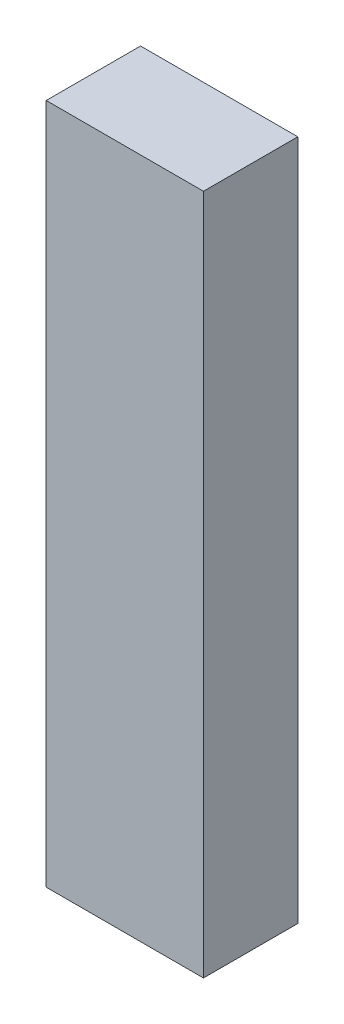
ISO-10303-21;
HEADER;
FILE_DESCRIPTION(('STEP AP214'),'2;1');
FILE_NAME('part.step','',(''),(''),'','','');
FILE_SCHEMA(('AUTOMOTIVE_DESIGN { 1 0 10303 214 1 1 1 1 }'));
ENDSEC;
DATA;
#1=APPLICATION_CONTEXT('core data for automotive mechanical design processes');
#2=APPLICATION_PROTOCOL_DEFINITION('international standard','automotive_design',2000,#1);
#3=PRODUCT_CONTEXT('',#1,'mechanical');
#4=PRODUCT('Part','Part','',(#3));
#5=PRODUCT_RELATED_PRODUCT_CATEGORY('part','',(#4));
#6=PRODUCT_DEFINITION_FORMATION('','',#4);
#7=PRODUCT_DEFINITION_CONTEXT('part definition',#1,'design');
#8=PRODUCT_DEFINITION('design','',#6,#7);
#9=PRODUCT_DEFINITION_SHAPE('','',#8);
#10=(LENGTH_UNIT() NAMED_UNIT(*) SI_UNIT(.MILLI.,.METRE.));
#11=(NAMED_UNIT(*) PLANE_ANGLE_UNIT() SI_UNIT($,.RADIAN.));
#12=(NAMED_UNIT(*) SI_UNIT($,.STERADIAN.) SOLID_ANGLE_UNIT());
#13=UNCERTAINTY_MEASURE_WITH_UNIT(LENGTH_MEASURE(1.E-05),#10,'distance_accuracy_value','');
#14=(GEOMETRIC_REPRESENTATION_CONTEXT(3) GLOBAL_UNCERTAINTY_ASSIGNED_CONTEXT((#13)) GLOBAL_UNIT_ASSIGNED_CONTEXT((#10,
#11,#12)) REPRESENTATION_CONTEXT('',''));
#15=CARTESIAN_POINT('',(0.,0.,0.));
#16=DIRECTION('',(0.,0.,1.));
#17=DIRECTION('',(1.,0.,0.));
#18=AXIS2_PLACEMENT_3D('',#15,#16,#17);
#19=CARTESIAN_POINT('',(12.2768764568764,56.5293162393162,9.));
#20=DIRECTION('',(1.,0.,0.));
#21=DIRECTION('',(0.,1.,0.));
#22=AXIS2_PLACEMENT_3D('',#19,#20,#21);
#23=PLANE('',#22);
#24=DIRECTION('',(0.,-1.,0.));
#25=VECTOR('',#24,1.);
#26=CARTESIAN_POINT('',(12.2768764568764,56.5293162393162,0.));
#27=LINE('',#26,#25);
#28=CARTESIAN_POINT('',(12.2768764568764,56.5293162393162,0.));
#29=VERTEX_POINT('',#28);
#30=CARTESIAN_POINT('',(12.2768764568764,-8.47068376068376,0.));
#31=VERTEX_POINT('',#30);
#32=EDGE_CURVE('E94',#29,#31,#27,.T.);
#33=ORIENTED_EDGE('',*,*,#32,.T.);
#34=DIRECTION('',(0.,0.,-1.));
#35=VECTOR('',#34,1.);
#36=CARTESIAN_POINT('',(12.2768764568764,-8.47068376068376,9.));
#37=LINE('',#36,#35);
#38=CARTESIAN_POINT('',(12.2768764568764,-8.47068376068376,9.));
#39=VERTEX_POINT('',#38);
#40=EDGE_CURVE('E11',#39,#31,#37,.T.);
#41=ORIENTED_EDGE('',*,*,#40,.F.);
#42=DIRECTION('',(0.,-1.,0.));
#43=VECTOR('',#42,1.);
#44=CARTESIAN_POINT('',(12.2768764568764,56.5293162393162,9.));
#45=LINE('',#44,#43);
#46=CARTESIAN_POINT('',(12.2768764568764,56.5293162393162,9.));
#47=VERTEX_POINT('',#46);
#48=EDGE_CURVE('E82',#47,#39,#45,.T.);
#49=ORIENTED_EDGE('',*,*,#48,.F.);
#50=DIRECTION('',(0.,0.,-1.));
#51=VECTOR('',#50,1.);
#52=CARTESIAN_POINT('',(12.2768764568764,56.5293162393162,9.));
#53=LINE('',#52,#51);
#54=EDGE_CURVE('E90',#47,#29,#53,.T.);
#55=ORIENTED_EDGE('',*,*,#54,.T.);
#56=EDGE_LOOP('',(#33,#41,#49,#55));
#57=FACE_BOUND('',#56,.T.);
#58=ADVANCED_FACE('F31',(#57),#23,.F.);
#59=CARTESIAN_POINT('',(12.2768764568764,-8.47068376068376,9.));
#60=DIRECTION('',(0.,1.,0.));
#61=DIRECTION('',(0.,0.,1.));
#62=AXIS2_PLACEMENT_3D('',#59,#60,#61);
#63=PLANE('',#62);
#64=DIRECTION('',(1.,0.,0.));
#65=VECTOR('',#64,1.);
#66=CARTESIAN_POINT('',(12.2768764568764,-8.47068376068376,0.));
#67=LINE('',#66,#65);
#68=CARTESIAN_POINT('',(27.2768764568764,-8.47068376068376,0.));
#69=VERTEX_POINT('',#68);
#70=EDGE_CURVE('E86',#31,#69,#67,.T.);
#71=ORIENTED_EDGE('',*,*,#70,.T.);
#72=DIRECTION('',(0.,0.,-1.));
#73=VECTOR('',#72,1.);
#74=CARTESIAN_POINT('',(27.2768764568764,-8.47068376068376,9.));
#75=LINE('',#74,#73);
#76=CARTESIAN_POINT('',(27.2768764568764,-8.47068376068376,9.));
#77=VERTEX_POINT('',#76);
#78=EDGE_CURVE('E39',#77,#69,#75,.T.);
#79=ORIENTED_EDGE('',*,*,#78,.F.);
#80=DIRECTION('',(1.,0.,0.));
#81=VECTOR('',#80,1.);
#82=CARTESIAN_POINT('',(12.2768764568764,-8.47068376068376,9.));
#83=LINE('',#82,#81);
#84=EDGE_CURVE('E77',#39,#77,#83,.T.);
#85=ORIENTED_EDGE('',*,*,#84,.F.);
#86=ORIENTED_EDGE('',*,*,#40,.T.);
#87=EDGE_LOOP('',(#71,#79,#85,#86));
#88=FACE_BOUND('',#87,.T.);
#89=ADVANCED_FACE('F85',(#88),#63,.F.);
#90=CARTESIAN_POINT('',(27.2768764568764,56.5293162393162,9.));
#91=DIRECTION('',(-1.,0.,0.));
#92=DIRECTION('',(0.,-1.,0.));
#93=AXIS2_PLACEMENT_3D('',#90,#91,#92);
#94=PLANE('',#93);
#95=DIRECTION('',(0.,1.,0.));
#96=VECTOR('',#95,1.);
#97=CARTESIAN_POINT('',(27.2768764568764,56.5293162393162,0.));
#98=LINE('',#97,#96);
#99=CARTESIAN_POINT('',(27.2768764568764,56.5293162393162,0.));
#100=VERTEX_POINT('',#99);
#101=EDGE_CURVE('E64',#69,#100,#98,.T.);
#102=ORIENTED_EDGE('',*,*,#101,.T.);
#103=DIRECTION('',(0.,0.,-1.));
#104=VECTOR('',#103,1.);
#105=CARTESIAN_POINT('',(27.2768764568764,56.5293162393162,9.));
#106=LINE('',#105,#104);
#107=CARTESIAN_POINT('',(27.2768764568764,56.5293162393162,9.));
#108=VERTEX_POINT('',#107);
#109=EDGE_CURVE('E87',#108,#100,#106,.T.);
#110=ORIENTED_EDGE('',*,*,#109,.F.);
#111=DIRECTION('',(0.,1.,0.));
#112=VECTOR('',#111,1.);
#113=CARTESIAN_POINT('',(27.2768764568764,56.5293162393162,9.));
#114=LINE('',#113,#112);
#115=EDGE_CURVE('E80',#77,#108,#114,.T.);
#116=ORIENTED_EDGE('',*,*,#115,.F.);
#117=ORIENTED_EDGE('',*,*,#78,.T.);
#118=EDGE_LOOP('',(#102,#110,#116,#117));
#119=FACE_BOUND('',#118,.T.);
#120=ADVANCED_FACE('F88',(#119),#94,.F.);
#121=CARTESIAN_POINT('',(12.2768764568764,56.5293162393162,9.));
#122=DIRECTION('',(0.,-1.,0.));
#123=DIRECTION('',(0.,0.,-1.));
#124=AXIS2_PLACEMENT_3D('',#121,#122,#123);
#125=PLANE('',#124);
#126=DIRECTION('',(-1.,0.,0.));
#127=VECTOR('',#126,1.);
#128=CARTESIAN_POINT('',(12.2768764568764,56.5293162393162,0.));
#129=LINE('',#128,#127);
#130=EDGE_CURVE('E70',#100,#29,#129,.T.);
#131=ORIENTED_EDGE('',*,*,#130,.T.);
#132=ORIENTED_EDGE('',*,*,#54,.F.);
#133=DIRECTION('',(-1.,0.,0.));
#134=VECTOR('',#133,1.);
#135=CARTESIAN_POINT('',(12.2768764568764,56.5293162393162,9.));
#136=LINE('',#135,#134);
#137=EDGE_CURVE('E47',#108,#47,#136,.T.);
#138=ORIENTED_EDGE('',*,*,#137,.F.);
#139=ORIENTED_EDGE('',*,*,#109,.T.);
#140=EDGE_LOOP('',(#131,#132,#138,#139));
#141=FACE_BOUND('',#140,.T.);
#142=ADVANCED_FACE('F101',(#141),#125,.F.);
#143=CARTESIAN_POINT('',(12.2768764568764,-8.47068376068376,9.));
#144=DIRECTION('',(0.,0.,1.));
#145=DIRECTION('',(1.,0.,0.));
#146=AXIS2_PLACEMENT_3D('',#143,#144,#145);
#147=PLANE('',#146);
#148=ORIENTED_EDGE('',*,*,#48,.T.);
#149=ORIENTED_EDGE('',*,*,#84,.T.);
#150=ORIENTED_EDGE('',*,*,#115,.T.);
#151=ORIENTED_EDGE('',*,*,#137,.T.);
#152=EDGE_LOOP('',(#148,#149,#150,#151));
#153=FACE_BOUND('',#152,.T.);
#154=ADVANCED_FACE('F78',(#153),#147,.T.);
#155=CARTESIAN_POINT('',(12.2768764568764,-8.47068376068376,0.));
#156=DIRECTION('',(0.,0.,1.));
#157=DIRECTION('',(1.,0.,0.));
#158=AXIS2_PLACEMENT_3D('',#155,#156,#157);
#159=PLANE('',#158);
#160=ORIENTED_EDGE('',*,*,#32,.F.);
#161=ORIENTED_EDGE('',*,*,#130,.F.);
#162=ORIENTED_EDGE('',*,*,#101,.F.);
#163=ORIENTED_EDGE('',*,*,#70,.F.);
#164=EDGE_LOOP('',(#160,#161,#162,#163));
#165=FACE_BOUND('',#164,.T.);
#166=ADVANCED_FACE('F104',(#165),#159,.F.);
#167=CLOSED_SHELL('',(#58,#89,#120,#142,#154,#166));
#168=MANIFOLD_SOLID_BREP('B2',#167);
#169=ADVANCED_BREP_SHAPE_REPRESENTATION('',(#18,#168),#14);
#170=SHAPE_DEFINITION_REPRESENTATION(#9,#169);
ENDSEC;
END-ISO-10303-21;
